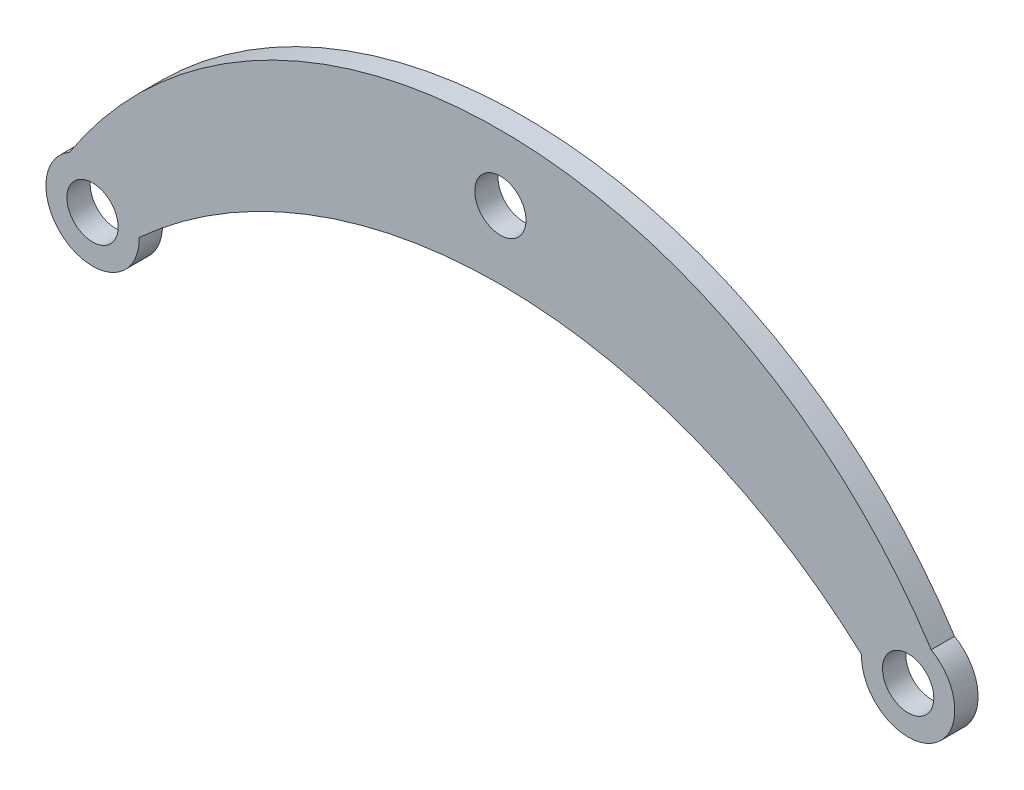
ISO-10303-21;
HEADER;
FILE_DESCRIPTION(('STEP AP214'),'2;1');
FILE_NAME('part.step','',(''),(''),'','','');
FILE_SCHEMA(('AUTOMOTIVE_DESIGN { 1 0 10303 214 1 1 1 1 }'));
ENDSEC;
DATA;
#1=APPLICATION_CONTEXT('core data for automotive mechanical design processes');
#2=APPLICATION_PROTOCOL_DEFINITION('international standard','automotive_design',2000,#1);
#3=PRODUCT_CONTEXT('',#1,'mechanical');
#4=PRODUCT('Part','Part','',(#3));
#5=PRODUCT_RELATED_PRODUCT_CATEGORY('part','',(#4));
#6=PRODUCT_DEFINITION_FORMATION('','',#4);
#7=PRODUCT_DEFINITION_CONTEXT('part definition',#1,'design');
#8=PRODUCT_DEFINITION('design','',#6,#7);
#9=PRODUCT_DEFINITION_SHAPE('','',#8);
#10=(LENGTH_UNIT() NAMED_UNIT(*) SI_UNIT(.MILLI.,.METRE.));
#11=(NAMED_UNIT(*) PLANE_ANGLE_UNIT() SI_UNIT($,.RADIAN.));
#12=(NAMED_UNIT(*) SI_UNIT($,.STERADIAN.) SOLID_ANGLE_UNIT());
#13=UNCERTAINTY_MEASURE_WITH_UNIT(LENGTH_MEASURE(1.E-05),#10,'distance_accuracy_value','');
#14=(GEOMETRIC_REPRESENTATION_CONTEXT(3) GLOBAL_UNCERTAINTY_ASSIGNED_CONTEXT((#13)) GLOBAL_UNIT_ASSIGNED_CONTEXT((#10,
#11,#12)) REPRESENTATION_CONTEXT('',''));
#15=CARTESIAN_POINT('',(0.,0.,0.));
#16=DIRECTION('',(0.,0.,1.));
#17=DIRECTION('',(1.,0.,0.));
#18=AXIS2_PLACEMENT_3D('',#15,#16,#17);
#19=CARTESIAN_POINT('',(262.5,-50.9288719686584,10.));
#20=DIRECTION('',(0.,0.,-1.));
#21=DIRECTION('',(-1.,0.,0.));
#22=AXIS2_PLACEMENT_3D('',#19,#20,#21);
#23=PLANE('',#22);
#24=CARTESIAN_POINT('',(175.,90.,10.));
#25=DIRECTION('',(0.,0.,1.));
#26=DIRECTION('',(1.,0.,0.));
#27=AXIS2_PLACEMENT_3D('',#24,#25,#26);
#28=CIRCLE('',#27,11.);
#29=CARTESIAN_POINT('',(186.,90.,10.));
#30=VERTEX_POINT('',#29);
#31=EDGE_CURVE('E124',#30,#30,#28,.T.);
#32=ORIENTED_EDGE('',*,*,#31,.F.);
#33=EDGE_LOOP('',(#32));
#34=FACE_BOUND('',#33,.T.);
#35=CARTESIAN_POINT('',(175.,-101.857743937317,10.));
#36=DIRECTION('',(0.,0.,1.));
#37=DIRECTION('',(-1.,0.,0.));
#38=AXIS2_PLACEMENT_3D('',#35,#36,#37);
#39=CIRCLE('',#38,220.);
#40=CARTESIAN_POINT('',(359.878048780487,17.3903465258838,10.));
#41=VERTEX_POINT('',#40);
#42=CARTESIAN_POINT('',(-9.87804878048742,17.3903465258837,10.));
#43=VERTEX_POINT('',#42);
#44=EDGE_CURVE('E85',#41,#43,#39,.T.);
#45=ORIENTED_EDGE('',*,*,#44,.T.);
#46=CARTESIAN_POINT('',(0.,0.,10.));
#47=DIRECTION('',(0.,0.,1.));
#48=DIRECTION('',(1.,0.,0.));
#49=AXIS2_PLACEMENT_3D('',#46,#47,#48);
#50=CIRCLE('',#49,20.0000000000001);
#51=CARTESIAN_POINT('',(19.9888361003483,0.66815518662014,10.));
#52=VERTEX_POINT('',#51);
#53=EDGE_CURVE('E80',#43,#52,#50,.T.);
#54=ORIENTED_EDGE('',*,*,#53,.T.);
#55=CARTESIAN_POINT('',(175.,-169.248115565993,10.));
#56=DIRECTION('',(0.,0.,-1.));
#57=DIRECTION('',(-1.,0.,0.));
#58=AXIS2_PLACEMENT_3D('',#55,#56,#57);
#59=CIRCLE('',#58,230.);
#60=CARTESIAN_POINT('',(330.011163899651,0.668155186620284,10.));
#61=VERTEX_POINT('',#60);
#62=EDGE_CURVE('E83',#52,#61,#59,.T.);
#63=ORIENTED_EDGE('',*,*,#62,.T.);
#64=CARTESIAN_POINT('',(350.,0.,10.));
#65=DIRECTION('',(0.,0.,1.));
#66=DIRECTION('',(1.,0.,0.));
#67=AXIS2_PLACEMENT_3D('',#64,#65,#66);
#68=CIRCLE('',#67,20.0000000000002);
#69=EDGE_CURVE('E50',#61,#41,#68,.T.);
#70=ORIENTED_EDGE('',*,*,#69,.T.);
#71=EDGE_LOOP('',(#45,#54,#63,#70));
#72=FACE_BOUND('',#71,.T.);
#73=CARTESIAN_POINT('',(0.,0.,10.));
#74=DIRECTION('',(0.,0.,1.));
#75=DIRECTION('',(1.,0.,0.));
#76=AXIS2_PLACEMENT_3D('',#73,#74,#75);
#77=CIRCLE('',#76,11.);
#78=CARTESIAN_POINT('',(11.,0.,10.));
#79=VERTEX_POINT('',#78);
#80=EDGE_CURVE('E100',#79,#79,#77,.T.);
#81=ORIENTED_EDGE('',*,*,#80,.F.);
#82=EDGE_LOOP('',(#81));
#83=FACE_BOUND('',#82,.T.);
#84=CARTESIAN_POINT('',(350.,0.,10.));
#85=DIRECTION('',(0.,0.,1.));
#86=DIRECTION('',(1.,0.,0.));
#87=AXIS2_PLACEMENT_3D('',#84,#85,#86);
#88=CIRCLE('',#87,11.);
#89=CARTESIAN_POINT('',(361.,0.,10.));
#90=VERTEX_POINT('',#89);
#91=EDGE_CURVE('E115',#90,#90,#88,.T.);
#92=ORIENTED_EDGE('',*,*,#91,.F.);
#93=EDGE_LOOP('',(#92));
#94=FACE_BOUND('',#93,.T.);
#95=ADVANCED_FACE('F33',(#34,#72,#83,#94),#23,.F.);
#96=CARTESIAN_POINT('',(262.5,-50.9288719686584,0.));
#97=DIRECTION('',(0.,0.,-1.));
#98=DIRECTION('',(-1.,0.,0.));
#99=AXIS2_PLACEMENT_3D('',#96,#97,#98);
#100=PLANE('',#99);
#101=CARTESIAN_POINT('',(175.,90.,0.));
#102=DIRECTION('',(0.,0.,1.));
#103=DIRECTION('',(1.,0.,0.));
#104=AXIS2_PLACEMENT_3D('',#101,#102,#103);
#105=CIRCLE('',#104,11.);
#106=CARTESIAN_POINT('',(186.,90.,0.));
#107=VERTEX_POINT('',#106);
#108=EDGE_CURVE('E121',#107,#107,#105,.T.);
#109=ORIENTED_EDGE('',*,*,#108,.T.);
#110=EDGE_LOOP('',(#109));
#111=FACE_BOUND('',#110,.T.);
#112=CARTESIAN_POINT('',(0.,0.,0.));
#113=DIRECTION('',(0.,0.,1.));
#114=DIRECTION('',(1.,0.,0.));
#115=AXIS2_PLACEMENT_3D('',#112,#113,#114);
#116=CIRCLE('',#115,11.);
#117=CARTESIAN_POINT('',(11.,0.,0.));
#118=VERTEX_POINT('',#117);
#119=EDGE_CURVE('E112',#118,#118,#116,.T.);
#120=ORIENTED_EDGE('',*,*,#119,.T.);
#121=EDGE_LOOP('',(#120));
#122=FACE_BOUND('',#121,.T.);
#123=CARTESIAN_POINT('',(175.,-101.857743937317,0.));
#124=DIRECTION('',(0.,0.,1.));
#125=DIRECTION('',(-1.,0.,0.));
#126=AXIS2_PLACEMENT_3D('',#123,#124,#125);
#127=CIRCLE('',#126,220.);
#128=CARTESIAN_POINT('',(359.878048780487,17.3903465258838,0.));
#129=VERTEX_POINT('',#128);
#130=CARTESIAN_POINT('',(-9.87804878048742,17.3903465258837,0.));
#131=VERTEX_POINT('',#130);
#132=EDGE_CURVE('E97',#129,#131,#127,.T.);
#133=ORIENTED_EDGE('',*,*,#132,.F.);
#134=CARTESIAN_POINT('',(350.,0.,0.));
#135=DIRECTION('',(0.,0.,1.));
#136=DIRECTION('',(1.,0.,0.));
#137=AXIS2_PLACEMENT_3D('',#134,#135,#136);
#138=CIRCLE('',#137,20.0000000000002);
#139=CARTESIAN_POINT('',(330.011163899651,0.668155186620284,0.));
#140=VERTEX_POINT('',#139);
#141=EDGE_CURVE('E73',#140,#129,#138,.T.);
#142=ORIENTED_EDGE('',*,*,#141,.F.);
#143=CARTESIAN_POINT('',(175.,-169.248115565993,0.));
#144=DIRECTION('',(0.,0.,-1.));
#145=DIRECTION('',(-1.,0.,0.));
#146=AXIS2_PLACEMENT_3D('',#143,#144,#145);
#147=CIRCLE('',#146,230.);
#148=CARTESIAN_POINT('',(19.9888361003483,0.66815518662014,0.));
#149=VERTEX_POINT('',#148);
#150=EDGE_CURVE('E67',#149,#140,#147,.T.);
#151=ORIENTED_EDGE('',*,*,#150,.F.);
#152=CARTESIAN_POINT('',(0.,0.,0.));
#153=DIRECTION('',(0.,0.,1.));
#154=DIRECTION('',(1.,0.,0.));
#155=AXIS2_PLACEMENT_3D('',#152,#153,#154);
#156=CIRCLE('',#155,20.0000000000001);
#157=EDGE_CURVE('E89',#131,#149,#156,.T.);
#158=ORIENTED_EDGE('',*,*,#157,.F.);
#159=EDGE_LOOP('',(#133,#142,#151,#158));
#160=FACE_BOUND('',#159,.T.);
#161=CARTESIAN_POINT('',(350.,0.,0.));
#162=DIRECTION('',(0.,0.,1.));
#163=DIRECTION('',(1.,0.,0.));
#164=AXIS2_PLACEMENT_3D('',#161,#162,#163);
#165=CIRCLE('',#164,11.);
#166=CARTESIAN_POINT('',(361.,0.,0.));
#167=VERTEX_POINT('',#166);
#168=EDGE_CURVE('E118',#167,#167,#165,.T.);
#169=ORIENTED_EDGE('',*,*,#168,.T.);
#170=EDGE_LOOP('',(#169));
#171=FACE_BOUND('',#170,.T.);
#172=ADVANCED_FACE('F108',(#111,#122,#160,#171),#100,.T.);
#173=CARTESIAN_POINT('',(175.,-101.857743937317,10.));
#174=DIRECTION('',(0.,0.,-1.));
#175=DIRECTION('',(-1.,0.,0.));
#176=AXIS2_PLACEMENT_3D('',#173,#174,#175);
#177=CYLINDRICAL_SURFACE('',#176,220.);
#178=ORIENTED_EDGE('',*,*,#132,.T.);
#179=DIRECTION('',(0.,0.,-1.));
#180=VECTOR('',#179,1.);
#181=CARTESIAN_POINT('',(-9.87804878048742,17.3903465258837,10.));
#182=LINE('',#181,#180);
#183=EDGE_CURVE('E11',#43,#131,#182,.T.);
#184=ORIENTED_EDGE('',*,*,#183,.F.);
#185=ORIENTED_EDGE('',*,*,#44,.F.);
#186=DIRECTION('',(0.,0.,-1.));
#187=VECTOR('',#186,1.);
#188=CARTESIAN_POINT('',(359.878048780487,17.3903465258838,10.));
#189=LINE('',#188,#187);
#190=EDGE_CURVE('E93',#41,#129,#189,.T.);
#191=ORIENTED_EDGE('',*,*,#190,.T.);
#192=EDGE_LOOP('',(#178,#184,#185,#191));
#193=FACE_BOUND('',#192,.T.);
#194=ADVANCED_FACE('F35',(#193),#177,.T.);
#195=CARTESIAN_POINT('',(0.,0.,10.));
#196=DIRECTION('',(0.,0.,-1.));
#197=DIRECTION('',(-1.,0.,0.));
#198=AXIS2_PLACEMENT_3D('',#195,#196,#197);
#199=CYLINDRICAL_SURFACE('',#198,20.0000000000001);
#200=ORIENTED_EDGE('',*,*,#157,.T.);
#201=DIRECTION('',(0.,0.,-1.));
#202=VECTOR('',#201,1.);
#203=CARTESIAN_POINT('',(19.9888361003483,0.66815518662014,10.));
#204=LINE('',#203,#202);
#205=EDGE_CURVE('E42',#52,#149,#204,.T.);
#206=ORIENTED_EDGE('',*,*,#205,.F.);
#207=ORIENTED_EDGE('',*,*,#53,.F.);
#208=ORIENTED_EDGE('',*,*,#183,.T.);
#209=EDGE_LOOP('',(#200,#206,#207,#208));
#210=FACE_BOUND('',#209,.T.);
#211=ADVANCED_FACE('F88',(#210),#199,.T.);
#212=CARTESIAN_POINT('',(175.,-169.248115565993,10.));
#213=DIRECTION('',(0.,0.,-1.));
#214=DIRECTION('',(-1.,0.,0.));
#215=AXIS2_PLACEMENT_3D('',#212,#213,#214);
#216=CYLINDRICAL_SURFACE('',#215,230.);
#217=ORIENTED_EDGE('',*,*,#150,.T.);
#218=DIRECTION('',(0.,0.,-1.));
#219=VECTOR('',#218,1.);
#220=CARTESIAN_POINT('',(330.011163899651,0.668155186620284,10.));
#221=LINE('',#220,#219);
#222=EDGE_CURVE('E90',#61,#140,#221,.T.);
#223=ORIENTED_EDGE('',*,*,#222,.F.);
#224=ORIENTED_EDGE('',*,*,#62,.F.);
#225=ORIENTED_EDGE('',*,*,#205,.T.);
#226=EDGE_LOOP('',(#217,#223,#224,#225));
#227=FACE_BOUND('',#226,.T.);
#228=ADVANCED_FACE('F91',(#227),#216,.F.);
#229=CARTESIAN_POINT('',(350.,0.,10.));
#230=DIRECTION('',(0.,0.,-1.));
#231=DIRECTION('',(-1.,0.,0.));
#232=AXIS2_PLACEMENT_3D('',#229,#230,#231);
#233=CYLINDRICAL_SURFACE('',#232,20.0000000000002);
#234=ORIENTED_EDGE('',*,*,#141,.T.);
#235=ORIENTED_EDGE('',*,*,#190,.F.);
#236=ORIENTED_EDGE('',*,*,#69,.F.);
#237=ORIENTED_EDGE('',*,*,#222,.T.);
#238=EDGE_LOOP('',(#234,#235,#236,#237));
#239=FACE_BOUND('',#238,.T.);
#240=ADVANCED_FACE('F105',(#239),#233,.T.);
#241=CARTESIAN_POINT('',(0.,0.,10.));
#242=DIRECTION('',(0.,0.,-1.));
#243=DIRECTION('',(-1.,0.,0.));
#244=AXIS2_PLACEMENT_3D('',#241,#242,#243);
#245=CYLINDRICAL_SURFACE('',#244,11.);
#246=ORIENTED_EDGE('',*,*,#80,.T.);
#247=EDGE_LOOP('',(#246));
#248=FACE_BOUND('',#247,.T.);
#249=ORIENTED_EDGE('',*,*,#119,.F.);
#250=EDGE_LOOP('',(#249));
#251=FACE_BOUND('',#250,.T.);
#252=ADVANCED_FACE('F146',(#248,#251),#245,.F.);
#253=CARTESIAN_POINT('',(350.,0.,10.));
#254=DIRECTION('',(0.,0.,-1.));
#255=DIRECTION('',(-1.,0.,0.));
#256=AXIS2_PLACEMENT_3D('',#253,#254,#255);
#257=CYLINDRICAL_SURFACE('',#256,11.);
#258=ORIENTED_EDGE('',*,*,#91,.T.);
#259=EDGE_LOOP('',(#258));
#260=FACE_BOUND('',#259,.T.);
#261=ORIENTED_EDGE('',*,*,#168,.F.);
#262=EDGE_LOOP('',(#261));
#263=FACE_BOUND('',#262,.T.);
#264=ADVANCED_FACE('F135',(#260,#263),#257,.F.);
#265=CARTESIAN_POINT('',(175.,90.,0.));
#266=DIRECTION('',(0.,0.,1.));
#267=DIRECTION('',(1.,0.,0.));
#268=AXIS2_PLACEMENT_3D('',#265,#266,#267);
#269=CYLINDRICAL_SURFACE('',#268,11.);
#270=ORIENTED_EDGE('',*,*,#108,.F.);
#271=EDGE_LOOP('',(#270));
#272=FACE_BOUND('',#271,.T.);
#273=ORIENTED_EDGE('',*,*,#31,.T.);
#274=EDGE_LOOP('',(#273));
#275=FACE_BOUND('',#274,.T.);
#276=ADVANCED_FACE('F132',(#272,#275),#269,.F.);
#277=CLOSED_SHELL('',(#95,#172,#194,#211,#228,#240,#252,#264,#276));
#278=MANIFOLD_SOLID_BREP('B2',#277);
#279=ADVANCED_BREP_SHAPE_REPRESENTATION('',(#18,#278),#14);
#280=SHAPE_DEFINITION_REPRESENTATION(#9,#279);
ENDSEC;
END-ISO-10303-21;
